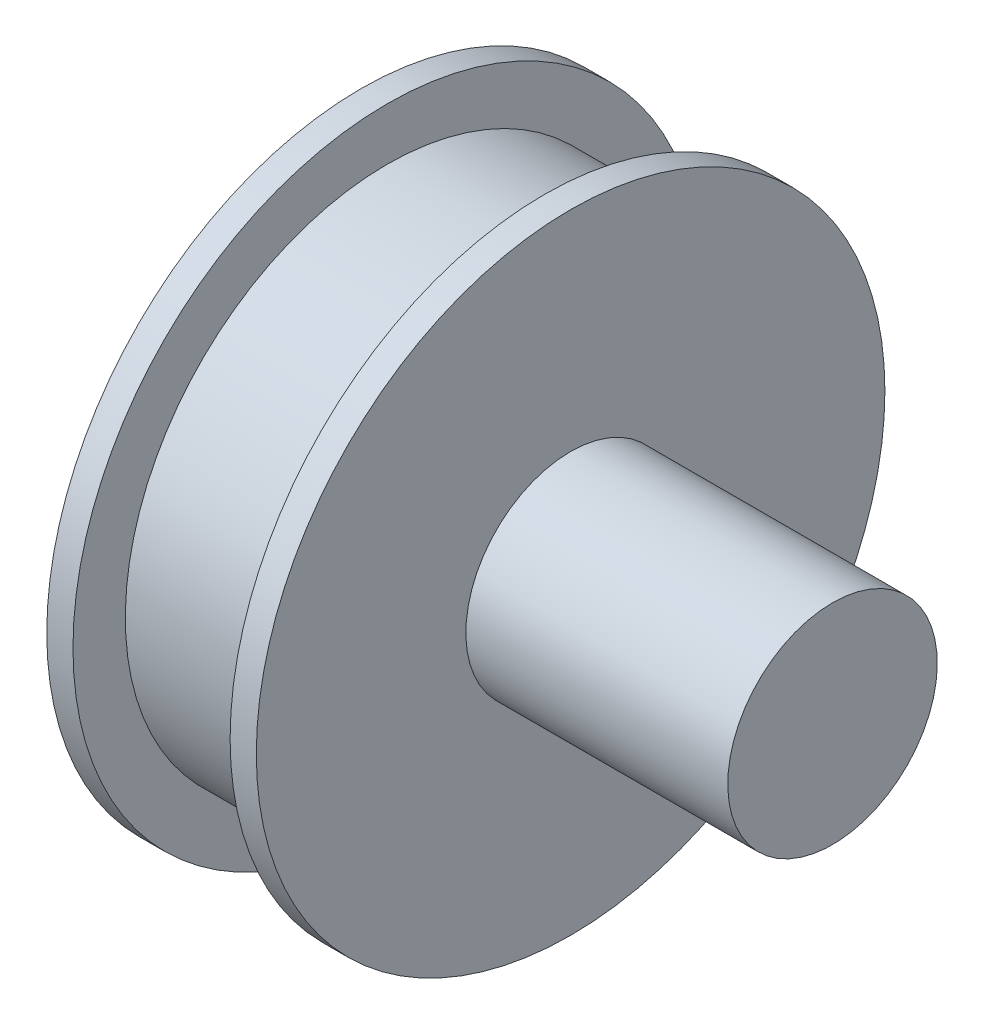
ISO-10303-21;
HEADER;
FILE_DESCRIPTION(('STEP AP214'),'2;1');
FILE_NAME('part.step','',(''),(''),'','','');
FILE_SCHEMA(('AUTOMOTIVE_DESIGN { 1 0 10303 214 1 1 1 1 }'));
ENDSEC;
DATA;
#1=APPLICATION_CONTEXT('core data for automotive mechanical design processes');
#2=APPLICATION_PROTOCOL_DEFINITION('international standard','automotive_design',2000,#1);
#3=PRODUCT_CONTEXT('',#1,'mechanical');
#4=PRODUCT('Part','Part','',(#3));
#5=PRODUCT_RELATED_PRODUCT_CATEGORY('part','',(#4));
#6=PRODUCT_DEFINITION_FORMATION('','',#4);
#7=PRODUCT_DEFINITION_CONTEXT('part definition',#1,'design');
#8=PRODUCT_DEFINITION('design','',#6,#7);
#9=PRODUCT_DEFINITION_SHAPE('','',#8);
#10=(LENGTH_UNIT() NAMED_UNIT(*) SI_UNIT(.MILLI.,.METRE.));
#11=(NAMED_UNIT(*) PLANE_ANGLE_UNIT() SI_UNIT($,.RADIAN.));
#12=(NAMED_UNIT(*) SI_UNIT($,.STERADIAN.) SOLID_ANGLE_UNIT());
#13=UNCERTAINTY_MEASURE_WITH_UNIT(LENGTH_MEASURE(1.E-05),#10,'distance_accuracy_value','');
#14=(GEOMETRIC_REPRESENTATION_CONTEXT(3) GLOBAL_UNCERTAINTY_ASSIGNED_CONTEXT((#13)) GLOBAL_UNIT_ASSIGNED_CONTEXT((#10,
#11,#12)) REPRESENTATION_CONTEXT('',''));
#15=CARTESIAN_POINT('',(0.,0.,0.));
#16=DIRECTION('',(0.,0.,1.));
#17=DIRECTION('',(1.,0.,0.));
#18=AXIS2_PLACEMENT_3D('',#15,#16,#17);
#19=CARTESIAN_POINT('',(45.,0.,0.));
#20=DIRECTION('',(1.,0.,0.));
#21=DIRECTION('',(0.,1.,0.));
#22=AXIS2_PLACEMENT_3D('',#19,#20,#21);
#23=CYLINDRICAL_SURFACE('',#22,30.);
#24=CARTESIAN_POINT('',(0.,0.,0.));
#25=DIRECTION('',(1.,0.,0.));
#26=DIRECTION('',(0.,1.,0.));
#27=AXIS2_PLACEMENT_3D('',#24,#25,#26);
#28=CIRCLE('',#27,30.);
#29=CARTESIAN_POINT('',(0.,30.,0.));
#30=VERTEX_POINT('',#29);
#31=EDGE_CURVE('E89',#30,#30,#28,.T.);
#32=ORIENTED_EDGE('',*,*,#31,.T.);
#33=EDGE_LOOP('',(#32));
#34=FACE_BOUND('',#33,.T.);
#35=CARTESIAN_POINT('',(2.50000000000001,0.,0.));
#36=DIRECTION('',(1.,0.,0.));
#37=DIRECTION('',(0.,1.,0.));
#38=AXIS2_PLACEMENT_3D('',#35,#36,#37);
#39=CIRCLE('',#38,30.);
#40=CARTESIAN_POINT('',(2.5,30.,0.));
#41=VERTEX_POINT('',#40);
#42=EDGE_CURVE('E50',#41,#41,#39,.T.);
#43=ORIENTED_EDGE('',*,*,#42,.F.);
#44=EDGE_LOOP('',(#43));
#45=FACE_BOUND('',#44,.T.);
#46=ADVANCED_FACE('F37',(#34,#45),#23,.T.);
#47=CARTESIAN_POINT('',(2.5,30.,0.));
#48=DIRECTION('',(1.,0.,0.));
#49=DIRECTION('',(0.,1.,0.));
#50=AXIS2_PLACEMENT_3D('',#47,#48,#49);
#51=PLANE('',#50);
#52=ORIENTED_EDGE('',*,*,#42,.T.);
#53=EDGE_LOOP('',(#52));
#54=FACE_BOUND('',#53,.T.);
#55=CARTESIAN_POINT('',(2.50000000000001,0.,0.));
#56=DIRECTION('',(1.,0.,0.));
#57=DIRECTION('',(0.,1.,0.));
#58=AXIS2_PLACEMENT_3D('',#55,#56,#57);
#59=CIRCLE('',#58,25.);
#60=CARTESIAN_POINT('',(2.5,25.,0.));
#61=VERTEX_POINT('',#60);
#62=EDGE_CURVE('E55',#61,#61,#59,.T.);
#63=ORIENTED_EDGE('',*,*,#62,.F.);
#64=EDGE_LOOP('',(#63));
#65=FACE_BOUND('',#64,.T.);
#66=ADVANCED_FACE('F130',(#54,#65),#51,.T.);
#67=CARTESIAN_POINT('',(45.,0.,0.));
#68=DIRECTION('',(1.,0.,0.));
#69=DIRECTION('',(0.,1.,0.));
#70=AXIS2_PLACEMENT_3D('',#67,#68,#69);
#71=CYLINDRICAL_SURFACE('',#70,25.);
#72=ORIENTED_EDGE('',*,*,#62,.T.);
#73=EDGE_LOOP('',(#72));
#74=FACE_BOUND('',#73,.T.);
#75=CARTESIAN_POINT('',(17.5,0.,0.));
#76=DIRECTION('',(1.,0.,0.));
#77=DIRECTION('',(0.,1.,0.));
#78=AXIS2_PLACEMENT_3D('',#75,#76,#77);
#79=CIRCLE('',#78,25.);
#80=CARTESIAN_POINT('',(17.5,25.,0.));
#81=VERTEX_POINT('',#80);
#82=EDGE_CURVE('E61',#81,#81,#79,.T.);
#83=ORIENTED_EDGE('',*,*,#82,.F.);
#84=EDGE_LOOP('',(#83));
#85=FACE_BOUND('',#84,.T.);
#86=ADVANCED_FACE('F135',(#74,#85),#71,.T.);
#87=CARTESIAN_POINT('',(17.5,25.,0.));
#88=DIRECTION('',(-1.,0.,0.));
#89=DIRECTION('',(0.,-1.,0.));
#90=AXIS2_PLACEMENT_3D('',#87,#88,#89);
#91=PLANE('',#90);
#92=ORIENTED_EDGE('',*,*,#82,.T.);
#93=EDGE_LOOP('',(#92));
#94=FACE_BOUND('',#93,.T.);
#95=CARTESIAN_POINT('',(17.5,0.,0.));
#96=DIRECTION('',(1.,0.,0.));
#97=DIRECTION('',(0.,1.,0.));
#98=AXIS2_PLACEMENT_3D('',#95,#96,#97);
#99=CIRCLE('',#98,30.);
#100=CARTESIAN_POINT('',(17.5,30.,0.));
#101=VERTEX_POINT('',#100);
#102=EDGE_CURVE('E65',#101,#101,#99,.T.);
#103=ORIENTED_EDGE('',*,*,#102,.F.);
#104=EDGE_LOOP('',(#103));
#105=FACE_BOUND('',#104,.T.);
#106=ADVANCED_FACE('F141',(#94,#105),#91,.T.);
#107=CARTESIAN_POINT('',(45.,0.,0.));
#108=DIRECTION('',(1.,0.,0.));
#109=DIRECTION('',(0.,1.,0.));
#110=AXIS2_PLACEMENT_3D('',#107,#108,#109);
#111=CYLINDRICAL_SURFACE('',#110,30.);
#112=ORIENTED_EDGE('',*,*,#102,.T.);
#113=EDGE_LOOP('',(#112));
#114=FACE_BOUND('',#113,.T.);
#115=CARTESIAN_POINT('',(20.,0.,0.));
#116=DIRECTION('',(1.,0.,0.));
#117=DIRECTION('',(0.,1.,0.));
#118=AXIS2_PLACEMENT_3D('',#115,#116,#117);
#119=CIRCLE('',#118,30.);
#120=CARTESIAN_POINT('',(20.,30.,0.));
#121=VERTEX_POINT('',#120);
#122=EDGE_CURVE('E69',#121,#121,#119,.T.);
#123=ORIENTED_EDGE('',*,*,#122,.F.);
#124=EDGE_LOOP('',(#123));
#125=FACE_BOUND('',#124,.T.);
#126=ADVANCED_FACE('F147',(#114,#125),#111,.T.);
#127=CARTESIAN_POINT('',(20.,30.,0.));
#128=DIRECTION('',(1.,0.,0.));
#129=DIRECTION('',(0.,1.,0.));
#130=AXIS2_PLACEMENT_3D('',#127,#128,#129);
#131=PLANE('',#130);
#132=ORIENTED_EDGE('',*,*,#122,.T.);
#133=EDGE_LOOP('',(#132));
#134=FACE_BOUND('',#133,.T.);
#135=CARTESIAN_POINT('',(20.,0.,0.));
#136=DIRECTION('',(1.,0.,0.));
#137=DIRECTION('',(0.,1.,0.));
#138=AXIS2_PLACEMENT_3D('',#135,#136,#137);
#139=CIRCLE('',#138,10.);
#140=CARTESIAN_POINT('',(20.,10.,0.));
#141=VERTEX_POINT('',#140);
#142=EDGE_CURVE('E73',#141,#141,#139,.T.);
#143=ORIENTED_EDGE('',*,*,#142,.F.);
#144=EDGE_LOOP('',(#143));
#145=FACE_BOUND('',#144,.T.);
#146=ADVANCED_FACE('F153',(#134,#145),#131,.T.);
#147=CARTESIAN_POINT('',(45.,0.,0.));
#148=DIRECTION('',(1.,0.,0.));
#149=DIRECTION('',(0.,1.,0.));
#150=AXIS2_PLACEMENT_3D('',#147,#148,#149);
#151=CYLINDRICAL_SURFACE('',#150,9.99999999999999);
#152=ORIENTED_EDGE('',*,*,#142,.T.);
#153=EDGE_LOOP('',(#152));
#154=FACE_BOUND('',#153,.T.);
#155=CARTESIAN_POINT('',(45.,0.,0.));
#156=DIRECTION('',(1.,0.,0.));
#157=DIRECTION('',(0.,1.,0.));
#158=AXIS2_PLACEMENT_3D('',#155,#156,#157);
#159=CIRCLE('',#158,9.99999999999999);
#160=CARTESIAN_POINT('',(45.,9.99999999999999,0.));
#161=VERTEX_POINT('',#160);
#162=EDGE_CURVE('E77',#161,#161,#159,.T.);
#163=ORIENTED_EDGE('',*,*,#162,.F.);
#164=EDGE_LOOP('',(#163));
#165=FACE_BOUND('',#164,.T.);
#166=ADVANCED_FACE('F159',(#154,#165),#151,.T.);
#167=CARTESIAN_POINT('',(45.,9.99999999999999,0.));
#168=DIRECTION('',(1.,0.,0.));
#169=DIRECTION('',(0.,1.,0.));
#170=AXIS2_PLACEMENT_3D('',#167,#168,#169);
#171=PLANE('',#170);
#172=ORIENTED_EDGE('',*,*,#162,.T.);
#173=EDGE_LOOP('',(#172));
#174=FACE_BOUND('',#173,.T.);
#175=ADVANCED_FACE('F123',(#174),#171,.T.);
#176=CARTESIAN_POINT('',(0.,4.99999999999999,0.));
#177=DIRECTION('',(-1.,0.,0.));
#178=DIRECTION('',(0.,-1.,0.));
#179=AXIS2_PLACEMENT_3D('',#176,#177,#178);
#180=PLANE('',#179);
#181=CARTESIAN_POINT('',(0.,0.,0.));
#182=DIRECTION('',(-1.,0.,0.));
#183=DIRECTION('',(0.,-1.,0.));
#184=AXIS2_PLACEMENT_3D('',#181,#182,#183);
#185=CIRCLE('',#184,22.5);
#186=CARTESIAN_POINT('',(0.,-22.5,0.));
#187=VERTEX_POINT('',#186);
#188=EDGE_CURVE('E94',#187,#187,#185,.T.);
#189=ORIENTED_EDGE('',*,*,#188,.F.);
#190=EDGE_LOOP('',(#189));
#191=FACE_BOUND('',#190,.T.);
#192=ORIENTED_EDGE('',*,*,#31,.F.);
#193=EDGE_LOOP('',(#192));
#194=FACE_BOUND('',#193,.T.);
#195=ADVANCED_FACE('F117',(#191,#194),#180,.T.);
#196=CARTESIAN_POINT('',(5.,0.,0.));
#197=DIRECTION('',(-1.,0.,0.));
#198=DIRECTION('',(0.,-1.,0.));
#199=AXIS2_PLACEMENT_3D('',#196,#197,#198);
#200=CYLINDRICAL_SURFACE('',#199,22.5);
#201=CARTESIAN_POINT('',(5.,0.,0.));
#202=DIRECTION('',(-1.,0.,0.));
#203=DIRECTION('',(0.,-1.,0.));
#204=AXIS2_PLACEMENT_3D('',#201,#202,#203);
#205=CIRCLE('',#204,22.5);
#206=CARTESIAN_POINT('',(5.,-22.5,0.));
#207=VERTEX_POINT('',#206);
#208=EDGE_CURVE('E93',#207,#207,#205,.T.);
#209=ORIENTED_EDGE('',*,*,#208,.F.);
#210=EDGE_LOOP('',(#209));
#211=FACE_BOUND('',#210,.T.);
#212=ORIENTED_EDGE('',*,*,#188,.T.);
#213=EDGE_LOOP('',(#212));
#214=FACE_BOUND('',#213,.T.);
#215=ADVANCED_FACE('F111',(#211,#214),#200,.F.);
#216=CARTESIAN_POINT('',(5.,0.,0.));
#217=DIRECTION('',(-1.,0.,0.));
#218=DIRECTION('',(0.,-1.,0.));
#219=AXIS2_PLACEMENT_3D('',#216,#217,#218);
#220=PLANE('',#219);
#221=CARTESIAN_POINT('',(5.,0.,0.));
#222=DIRECTION('',(-1.,0.,0.));
#223=DIRECTION('',(0.,-1.,0.));
#224=AXIS2_PLACEMENT_3D('',#221,#222,#223);
#225=CIRCLE('',#224,10.);
#226=CARTESIAN_POINT('',(5.,-10.,0.));
#227=VERTEX_POINT('',#226);
#228=EDGE_CURVE('E98',#227,#227,#225,.T.);
#229=ORIENTED_EDGE('',*,*,#228,.F.);
#230=EDGE_LOOP('',(#229));
#231=FACE_BOUND('',#230,.T.);
#232=ORIENTED_EDGE('',*,*,#208,.T.);
#233=EDGE_LOOP('',(#232));
#234=FACE_BOUND('',#233,.T.);
#235=ADVANCED_FACE('F108',(#231,#234),#220,.T.);
#236=CARTESIAN_POINT('',(5.,0.,0.));
#237=DIRECTION('',(-1.,0.,0.));
#238=DIRECTION('',(0.,-1.,0.));
#239=AXIS2_PLACEMENT_3D('',#236,#237,#238);
#240=CYLINDRICAL_SURFACE('',#239,10.);
#241=CARTESIAN_POINT('',(1.,0.,0.));
#242=DIRECTION('',(-1.,0.,0.));
#243=DIRECTION('',(0.,-1.,0.));
#244=AXIS2_PLACEMENT_3D('',#241,#242,#243);
#245=CIRCLE('',#244,10.);
#246=CARTESIAN_POINT('',(1.00000000000001,-10.,0.));
#247=VERTEX_POINT('',#246);
#248=EDGE_CURVE('E10',#247,#247,#245,.F.);
#249=ORIENTED_EDGE('',*,*,#248,.T.);
#250=EDGE_LOOP('',(#249));
#251=FACE_BOUND('',#250,.T.);
#252=ORIENTED_EDGE('',*,*,#228,.T.);
#253=EDGE_LOOP('',(#252));
#254=FACE_BOUND('',#253,.T.);
#255=ADVANCED_FACE('F106',(#251,#254),#240,.T.);
#256=CARTESIAN_POINT('',(5.,4.99999999999999,0.));
#257=DIRECTION('',(-1.,0.,0.));
#258=DIRECTION('',(0.,-1.,0.));
#259=AXIS2_PLACEMENT_3D('',#256,#257,#258);
#260=PLANE('',#259);
#261=CARTESIAN_POINT('',(5.,0.,0.));
#262=DIRECTION('',(1.,0.,0.));
#263=DIRECTION('',(0.,1.,0.));
#264=AXIS2_PLACEMENT_3D('',#261,#262,#263);
#265=CIRCLE('',#264,5.);
#266=CARTESIAN_POINT('',(5.,4.99999999999999,0.));
#267=VERTEX_POINT('',#266);
#268=EDGE_CURVE('E81',#267,#267,#265,.T.);
#269=ORIENTED_EDGE('',*,*,#268,.F.);
#270=EDGE_LOOP('',(#269));
#271=FACE_BOUND('',#270,.T.);
#272=ADVANCED_FACE('F173',(#271),#260,.T.);
#273=CARTESIAN_POINT('',(45.,0.,0.));
#274=DIRECTION('',(1.,0.,0.));
#275=DIRECTION('',(0.,1.,0.));
#276=AXIS2_PLACEMENT_3D('',#273,#274,#275);
#277=CYLINDRICAL_SURFACE('',#276,5.);
#278=ORIENTED_EDGE('',*,*,#268,.T.);
#279=EDGE_LOOP('',(#278));
#280=FACE_BOUND('',#279,.T.);
#281=CARTESIAN_POINT('',(0.,0.,0.));
#282=DIRECTION('',(1.,0.,0.));
#283=DIRECTION('',(0.,1.,0.));
#284=AXIS2_PLACEMENT_3D('',#281,#282,#283);
#285=CIRCLE('',#284,5.);
#286=CARTESIAN_POINT('',(0.,4.99999999999999,0.));
#287=VERTEX_POINT('',#286);
#288=EDGE_CURVE('E85',#287,#287,#285,.T.);
#289=ORIENTED_EDGE('',*,*,#288,.F.);
#290=EDGE_LOOP('',(#289));
#291=FACE_BOUND('',#290,.T.);
#292=ADVANCED_FACE('F176',(#280,#291),#277,.F.);
#293=CARTESIAN_POINT('',(0.,0.,0.));
#294=DIRECTION('',(-1.,0.,0.));
#295=DIRECTION('',(0.,-1.,0.));
#296=AXIS2_PLACEMENT_3D('',#293,#294,#295);
#297=CIRCLE('',#296,9.);
#298=CARTESIAN_POINT('',(0.,-9.00000000000001,0.));
#299=VERTEX_POINT('',#298);
#300=EDGE_CURVE('E45',#299,#299,#297,.T.);
#301=ORIENTED_EDGE('',*,*,#300,.T.);
#302=EDGE_LOOP('',(#301));
#303=FACE_BOUND('',#302,.T.);
#304=ORIENTED_EDGE('',*,*,#288,.T.);
#305=EDGE_LOOP('',(#304));
#306=FACE_BOUND('',#305,.T.);
#307=ADVANCED_FACE('F125',(#303,#306),#180,.T.);
#308=CARTESIAN_POINT('',(1.,0.,0.));
#309=DIRECTION('',(-1.,0.,0.));
#310=DIRECTION('',(0.,-1.,0.));
#311=AXIS2_PLACEMENT_3D('',#308,#309,#310);
#312=TOROIDAL_SURFACE('',#311,9.,1.);
#313=ORIENTED_EDGE('',*,*,#248,.F.);
#314=EDGE_LOOP('',(#313));
#315=FACE_BOUND('',#314,.T.);
#316=ORIENTED_EDGE('',*,*,#300,.F.);
#317=EDGE_LOOP('',(#316));
#318=FACE_BOUND('',#317,.T.);
#319=ADVANCED_FACE('F39',(#315,#318),#312,.T.);
#320=CLOSED_SHELL('',(#46,#66,#86,#106,#126,#146,#166,#175,#195,#215,#235,#255,#272,#292,#307,#319));
#321=MANIFOLD_SOLID_BREP('B2',#320);
#322=ADVANCED_BREP_SHAPE_REPRESENTATION('',(#18,#321),#14);
#323=SHAPE_DEFINITION_REPRESENTATION(#9,#322);
ENDSEC;
END-ISO-10303-21;
